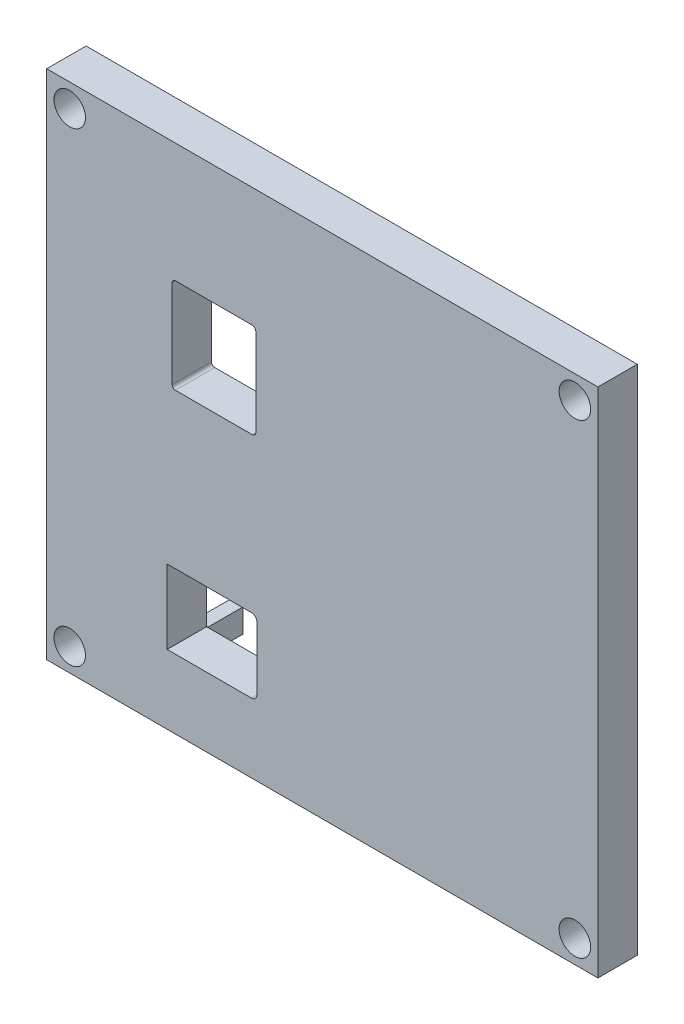
ISO-10303-21;
HEADER;
FILE_DESCRIPTION(('STEP AP214'),'2;1');
FILE_NAME('part.step','',(''),(''),'','','');
FILE_SCHEMA(('AUTOMOTIVE_DESIGN { 1 0 10303 214 1 1 1 1 }'));
ENDSEC;
DATA;
#1=APPLICATION_CONTEXT('core data for automotive mechanical design processes');
#2=APPLICATION_PROTOCOL_DEFINITION('international standard','automotive_design',2000,#1);
#3=PRODUCT_CONTEXT('',#1,'mechanical');
#4=PRODUCT('Part','Part','',(#3));
#5=PRODUCT_RELATED_PRODUCT_CATEGORY('part','',(#4));
#6=PRODUCT_DEFINITION_FORMATION('','',#4);
#7=PRODUCT_DEFINITION_CONTEXT('part definition',#1,'design');
#8=PRODUCT_DEFINITION('design','',#6,#7);
#9=PRODUCT_DEFINITION_SHAPE('','',#8);
#10=(LENGTH_UNIT() NAMED_UNIT(*) SI_UNIT(.MILLI.,.METRE.));
#11=(NAMED_UNIT(*) PLANE_ANGLE_UNIT() SI_UNIT($,.RADIAN.));
#12=(NAMED_UNIT(*) SI_UNIT($,.STERADIAN.) SOLID_ANGLE_UNIT());
#13=UNCERTAINTY_MEASURE_WITH_UNIT(LENGTH_MEASURE(1.E-05),#10,'distance_accuracy_value','');
#14=(GEOMETRIC_REPRESENTATION_CONTEXT(3) GLOBAL_UNCERTAINTY_ASSIGNED_CONTEXT((#13)) GLOBAL_UNIT_ASSIGNED_CONTEXT((#10,
#11,#12)) REPRESENTATION_CONTEXT('',''));
#15=CARTESIAN_POINT('',(0.,0.,0.));
#16=DIRECTION('',(0.,0.,1.));
#17=DIRECTION('',(1.,0.,0.));
#18=AXIS2_PLACEMENT_3D('',#15,#16,#17);
#19=CARTESIAN_POINT('',(0.,0.,0.));
#20=DIRECTION('',(0.,0.,1.));
#21=DIRECTION('',(1.,0.,0.));
#22=AXIS2_PLACEMENT_3D('',#19,#20,#21);
#23=PLANE('',#22);
#24=DIRECTION('',(0.,-1.,0.));
#25=VECTOR('',#24,1.);
#26=CARTESIAN_POINT('',(15.5,8.85,0.));
#27=LINE('',#26,#25);
#28=CARTESIAN_POINT('',(15.5,8.78500000000006,0.));
#29=VERTEX_POINT('',#28);
#30=CARTESIAN_POINT('',(15.5,5.85,0.));
#31=VERTEX_POINT('',#30);
#32=EDGE_CURVE('E11',#29,#31,#27,.T.);
#33=ORIENTED_EDGE('',*,*,#32,.F.);
#34=DIRECTION('',(1.,0.,0.));
#35=VECTOR('',#34,1.);
#36=CARTESIAN_POINT('',(0.,8.78500000000006,0.));
#37=LINE('',#36,#35);
#38=CARTESIAN_POINT('',(25.9999999999999,8.78500000000006,0.));
#39=VERTEX_POINT('',#38);
#40=EDGE_CURVE('E395',#29,#39,#37,.T.);
#41=ORIENTED_EDGE('',*,*,#40,.T.);
#42=CARTESIAN_POINT('',(25.9999999999999,9.48500000000006,0.));
#43=DIRECTION('',(0.,0.,1.));
#44=DIRECTION('',(1.,0.,0.));
#45=AXIS2_PLACEMENT_3D('',#42,#43,#44);
#46=CIRCLE('',#45,0.70000000000005);
#47=CARTESIAN_POINT('',(26.7,9.48500000000006,0.));
#48=VERTEX_POINT('',#47);
#49=EDGE_CURVE('E301',#39,#48,#46,.T.);
#50=ORIENTED_EDGE('',*,*,#49,.T.);
#51=DIRECTION('',(0.,1.,0.));
#52=VECTOR('',#51,1.);
#53=CARTESIAN_POINT('',(26.7,0.,0.));
#54=LINE('',#53,#52);
#55=CARTESIAN_POINT('',(26.7,17.485,0.));
#56=VERTEX_POINT('',#55);
#57=EDGE_CURVE('E413',#48,#56,#54,.T.);
#58=ORIENTED_EDGE('',*,*,#57,.T.);
#59=CARTESIAN_POINT('',(26.,17.485,0.));
#60=DIRECTION('',(0.,0.,1.));
#61=DIRECTION('',(1.,0.,0.));
#62=AXIS2_PLACEMENT_3D('',#59,#60,#61);
#63=CIRCLE('',#62,0.699999999999999);
#64=CARTESIAN_POINT('',(25.9999999999999,18.185,0.));
#65=VERTEX_POINT('',#64);
#66=EDGE_CURVE('E409',#56,#65,#63,.T.);
#67=ORIENTED_EDGE('',*,*,#66,.T.);
#68=DIRECTION('',(-1.,0.,0.));
#69=VECTOR('',#68,1.);
#70=CARTESIAN_POINT('',(0.,18.185,0.));
#71=LINE('',#70,#69);
#72=CARTESIAN_POINT('',(15.3,18.185,0.));
#73=VERTEX_POINT('',#72);
#74=EDGE_CURVE('E401',#65,#73,#71,.T.);
#75=ORIENTED_EDGE('',*,*,#74,.T.);
#76=DIRECTION('',(0.,-1.,0.));
#77=VECTOR('',#76,1.);
#78=CARTESIAN_POINT('',(15.3,0.,0.));
#79=LINE('',#78,#77);
#80=CARTESIAN_POINT('',(15.3,8.85,0.));
#81=VERTEX_POINT('',#80);
#82=EDGE_CURVE('E397',#73,#81,#79,.T.);
#83=ORIENTED_EDGE('',*,*,#82,.T.);
#84=DIRECTION('',(1.,0.,0.));
#85=VECTOR('',#84,1.);
#86=CARTESIAN_POINT('',(15.5,8.85,0.));
#87=LINE('',#86,#85);
#88=CARTESIAN_POINT('',(13.85,8.85,0.));
#89=VERTEX_POINT('',#88);
#90=EDGE_CURVE('E279',#89,#81,#87,.T.);
#91=ORIENTED_EDGE('',*,*,#90,.F.);
#92=DIRECTION('',(0.,-1.,0.));
#93=VECTOR('',#92,1.);
#94=CARTESIAN_POINT('',(13.85,8.85,0.));
#95=LINE('',#94,#93);
#96=CARTESIAN_POINT('',(13.85,5.85,0.));
#97=VERTEX_POINT('',#96);
#98=EDGE_CURVE('E292',#89,#97,#95,.T.);
#99=ORIENTED_EDGE('',*,*,#98,.T.);
#100=DIRECTION('',(1.,0.,0.));
#101=VECTOR('',#100,1.);
#102=CARTESIAN_POINT('',(15.5,5.85,0.));
#103=LINE('',#102,#101);
#104=EDGE_CURVE('E75',#97,#31,#103,.T.);
#105=ORIENTED_EDGE('',*,*,#104,.T.);
#106=EDGE_LOOP('',(#33,#41,#50,#58,#67,#75,#83,#91,#99,#105));
#107=FACE_BOUND('',#106,.T.);
#108=CARTESIAN_POINT('',(26.09,49.39,0.));
#109=DIRECTION('',(0.,0.,1.));
#110=DIRECTION('',(1.,0.,0.));
#111=AXIS2_PLACEMENT_3D('',#108,#109,#110);
#112=CIRCLE('',#111,0.46);
#113=CARTESIAN_POINT('',(26.55,49.39,0.));
#114=VERTEX_POINT('',#113);
#115=CARTESIAN_POINT('',(26.09,49.85,0.));
#116=VERTEX_POINT('',#115);
#117=EDGE_CURVE('E414',#114,#116,#112,.T.);
#118=ORIENTED_EDGE('',*,*,#117,.T.);
#119=DIRECTION('',(-1.,0.,0.));
#120=VECTOR('',#119,1.);
#121=CARTESIAN_POINT('',(0.,49.85,0.));
#122=LINE('',#121,#120);
#123=CARTESIAN_POINT('',(16.34,49.85,0.));
#124=VERTEX_POINT('',#123);
#125=EDGE_CURVE('E444',#116,#124,#122,.T.);
#126=ORIENTED_EDGE('',*,*,#125,.T.);
#127=CARTESIAN_POINT('',(16.34,49.44,0.));
#128=DIRECTION('',(0.,0.,1.));
#129=DIRECTION('',(1.,0.,0.));
#130=AXIS2_PLACEMENT_3D('',#127,#128,#129);
#131=CIRCLE('',#130,0.410000000000001);
#132=CARTESIAN_POINT('',(15.93,49.44,0.));
#133=VERTEX_POINT('',#132);
#134=EDGE_CURVE('E438',#124,#133,#131,.T.);
#135=ORIENTED_EDGE('',*,*,#134,.T.);
#136=DIRECTION('',(0.,-1.,0.));
#137=VECTOR('',#136,1.);
#138=CARTESIAN_POINT('',(15.93,0.,0.));
#139=LINE('',#138,#137);
#140=CARTESIAN_POINT('',(15.93,38.22,0.));
#141=VERTEX_POINT('',#140);
#142=EDGE_CURVE('E434',#133,#141,#139,.T.);
#143=ORIENTED_EDGE('',*,*,#142,.T.);
#144=CARTESIAN_POINT('',(16.34,38.22,0.));
#145=DIRECTION('',(0.,0.,1.));
#146=DIRECTION('',(1.,0.,0.));
#147=AXIS2_PLACEMENT_3D('',#144,#145,#146);
#148=CIRCLE('',#147,0.410000000000001);
#149=CARTESIAN_POINT('',(16.34,37.81,0.));
#150=VERTEX_POINT('',#149);
#151=EDGE_CURVE('E431',#141,#150,#148,.T.);
#152=ORIENTED_EDGE('',*,*,#151,.T.);
#153=DIRECTION('',(1.,0.,0.));
#154=VECTOR('',#153,1.);
#155=CARTESIAN_POINT('',(0.,37.81,0.));
#156=LINE('',#155,#154);
#157=CARTESIAN_POINT('',(26.09,37.81,0.));
#158=VERTEX_POINT('',#157);
#159=EDGE_CURVE('E430',#150,#158,#156,.T.);
#160=ORIENTED_EDGE('',*,*,#159,.T.);
#161=CARTESIAN_POINT('',(26.09,38.27,0.));
#162=DIRECTION('',(0.,0.,1.));
#163=DIRECTION('',(1.,0.,0.));
#164=AXIS2_PLACEMENT_3D('',#161,#162,#163);
#165=CIRCLE('',#164,0.46);
#166=CARTESIAN_POINT('',(26.55,38.27,0.));
#167=VERTEX_POINT('',#166);
#168=EDGE_CURVE('E421',#158,#167,#165,.T.);
#169=ORIENTED_EDGE('',*,*,#168,.T.);
#170=DIRECTION('',(0.,1.,0.));
#171=VECTOR('',#170,1.);
#172=CARTESIAN_POINT('',(26.55,0.,0.));
#173=LINE('',#172,#171);
#174=EDGE_CURVE('E420',#167,#114,#173,.T.);
#175=ORIENTED_EDGE('',*,*,#174,.T.);
#176=EDGE_LOOP('',(#118,#126,#135,#143,#152,#160,#169,#175));
#177=FACE_BOUND('',#176,.T.);
#178=CARTESIAN_POINT('',(67.075,2.925,0.));
#179=DIRECTION('',(0.,0.,1.));
#180=DIRECTION('',(1.,0.,0.));
#181=AXIS2_PLACEMENT_3D('',#178,#179,#180);
#182=CIRCLE('',#181,2.);
#183=CARTESIAN_POINT('',(69.075,2.925,0.));
#184=VERTEX_POINT('',#183);
#185=EDGE_CURVE('E449',#184,#184,#182,.T.);
#186=ORIENTED_EDGE('',*,*,#185,.T.);
#187=EDGE_LOOP('',(#186));
#188=FACE_BOUND('',#187,.T.);
#189=CARTESIAN_POINT('',(2.925,62.075,0.));
#190=DIRECTION('',(0.,0.,1.));
#191=DIRECTION('',(1.,0.,0.));
#192=AXIS2_PLACEMENT_3D('',#189,#190,#191);
#193=CIRCLE('',#192,2.);
#194=CARTESIAN_POINT('',(4.925,62.075,0.));
#195=VERTEX_POINT('',#194);
#196=EDGE_CURVE('E453',#195,#195,#193,.T.);
#197=ORIENTED_EDGE('',*,*,#196,.T.);
#198=EDGE_LOOP('',(#197));
#199=FACE_BOUND('',#198,.T.);
#200=CARTESIAN_POINT('',(2.925,2.925,0.));
#201=DIRECTION('',(0.,0.,1.));
#202=DIRECTION('',(1.,0.,0.));
#203=AXIS2_PLACEMENT_3D('',#200,#201,#202);
#204=CIRCLE('',#203,2.);
#205=CARTESIAN_POINT('',(4.925,2.925,0.));
#206=VERTEX_POINT('',#205);
#207=EDGE_CURVE('E454',#206,#206,#204,.T.);
#208=ORIENTED_EDGE('',*,*,#207,.T.);
#209=EDGE_LOOP('',(#208));
#210=FACE_BOUND('',#209,.T.);
#211=CARTESIAN_POINT('',(67.075,62.075,0.));
#212=DIRECTION('',(0.,0.,1.));
#213=DIRECTION('',(1.,0.,0.));
#214=AXIS2_PLACEMENT_3D('',#211,#212,#213);
#215=CIRCLE('',#214,2.);
#216=CARTESIAN_POINT('',(69.075,62.075,0.));
#217=VERTEX_POINT('',#216);
#218=EDGE_CURVE('E459',#217,#217,#215,.T.);
#219=ORIENTED_EDGE('',*,*,#218,.T.);
#220=EDGE_LOOP('',(#219));
#221=FACE_BOUND('',#220,.T.);
#222=DIRECTION('',(0.,-1.,0.));
#223=VECTOR('',#222,1.);
#224=CARTESIAN_POINT('',(0.,0.,0.));
#225=LINE('',#224,#223);
#226=CARTESIAN_POINT('',(0.,65.,0.));
#227=VERTEX_POINT('',#226);
#228=CARTESIAN_POINT('',(0.,0.,0.));
#229=VERTEX_POINT('',#228);
#230=EDGE_CURVE('E462',#227,#229,#225,.T.);
#231=ORIENTED_EDGE('',*,*,#230,.F.);
#232=DIRECTION('',(-1.,0.,0.));
#233=VECTOR('',#232,1.);
#234=CARTESIAN_POINT('',(0.,65.,0.));
#235=LINE('',#234,#233);
#236=CARTESIAN_POINT('',(70.,65.,0.));
#237=VERTEX_POINT('',#236);
#238=EDGE_CURVE('E310',#237,#227,#235,.T.);
#239=ORIENTED_EDGE('',*,*,#238,.F.);
#240=DIRECTION('',(0.,1.,0.));
#241=VECTOR('',#240,1.);
#242=CARTESIAN_POINT('',(70.,0.,0.));
#243=LINE('',#242,#241);
#244=CARTESIAN_POINT('',(70.,0.,0.));
#245=VERTEX_POINT('',#244);
#246=EDGE_CURVE('E469',#245,#237,#243,.T.);
#247=ORIENTED_EDGE('',*,*,#246,.F.);
#248=DIRECTION('',(1.,0.,0.));
#249=VECTOR('',#248,1.);
#250=CARTESIAN_POINT('',(0.,0.,0.));
#251=LINE('',#250,#249);
#252=EDGE_CURVE('E470',#229,#245,#251,.T.);
#253=ORIENTED_EDGE('',*,*,#252,.F.);
#254=EDGE_LOOP('',(#231,#239,#247,#253));
#255=FACE_BOUND('',#254,.T.);
#256=DIRECTION('',(-1.,0.,0.));
#257=VECTOR('',#256,1.);
#258=CARTESIAN_POINT('',(13.85,56.15,0.));
#259=LINE('',#258,#257);
#260=CARTESIAN_POINT('',(15.93,56.15,0.));
#261=VERTEX_POINT('',#260);
#262=CARTESIAN_POINT('',(13.85,56.15,0.));
#263=VERTEX_POINT('',#262);
#264=EDGE_CURVE('E248',#261,#263,#259,.T.);
#265=ORIENTED_EDGE('',*,*,#264,.F.);
#266=DIRECTION('',(0.,1.,0.));
#267=VECTOR('',#266,1.);
#268=CARTESIAN_POINT('',(15.93,56.15,0.));
#269=LINE('',#268,#267);
#270=CARTESIAN_POINT('',(15.93,59.15,0.));
#271=VERTEX_POINT('',#270);
#272=EDGE_CURVE('E263',#261,#271,#269,.T.);
#273=ORIENTED_EDGE('',*,*,#272,.T.);
#274=DIRECTION('',(-1.,0.,0.));
#275=VECTOR('',#274,1.);
#276=CARTESIAN_POINT('',(13.85,59.15,0.));
#277=LINE('',#276,#275);
#278=CARTESIAN_POINT('',(13.85,59.15,0.));
#279=VERTEX_POINT('',#278);
#280=EDGE_CURVE('E249',#271,#279,#277,.T.);
#281=ORIENTED_EDGE('',*,*,#280,.T.);
#282=DIRECTION('',(0.,1.,0.));
#283=VECTOR('',#282,1.);
#284=CARTESIAN_POINT('',(13.85,56.15,0.));
#285=LINE('',#284,#283);
#286=EDGE_CURVE('E565',#263,#279,#285,.T.);
#287=ORIENTED_EDGE('',*,*,#286,.F.);
#288=EDGE_LOOP('',(#265,#273,#281,#287));
#289=FACE_BOUND('',#288,.T.);
#290=ADVANCED_FACE('F44',(#107,#177,#188,#199,#210,#221,#255,#289),#23,.F.);
#291=CARTESIAN_POINT('',(0.,0.,5.));
#292=DIRECTION('',(1.,0.,0.));
#293=DIRECTION('',(0.,0.,-1.));
#294=AXIS2_PLACEMENT_3D('',#291,#292,#293);
#295=PLANE('',#294);
#296=ORIENTED_EDGE('',*,*,#230,.T.);
#297=DIRECTION('',(0.,0.,-1.));
#298=VECTOR('',#297,1.);
#299=CARTESIAN_POINT('',(0.,0.,5.));
#300=LINE('',#299,#298);
#301=CARTESIAN_POINT('',(0.,0.,5.));
#302=VERTEX_POINT('',#301);
#303=EDGE_CURVE('E54',#302,#229,#300,.T.);
#304=ORIENTED_EDGE('',*,*,#303,.F.);
#305=DIRECTION('',(0.,-1.,0.));
#306=VECTOR('',#305,1.);
#307=CARTESIAN_POINT('',(0.,0.,5.));
#308=LINE('',#307,#306);
#309=CARTESIAN_POINT('',(0.,65.,5.));
#310=VERTEX_POINT('',#309);
#311=EDGE_CURVE('E380',#310,#302,#308,.T.);
#312=ORIENTED_EDGE('',*,*,#311,.F.);
#313=DIRECTION('',(0.,0.,-1.));
#314=VECTOR('',#313,1.);
#315=CARTESIAN_POINT('',(0.,65.,5.));
#316=LINE('',#315,#314);
#317=EDGE_CURVE('E474',#310,#227,#316,.T.);
#318=ORIENTED_EDGE('',*,*,#317,.T.);
#319=EDGE_LOOP('',(#296,#304,#312,#318));
#320=FACE_BOUND('',#319,.T.);
#321=ADVANCED_FACE('F593',(#320),#295,.F.);
#322=CARTESIAN_POINT('',(0.,0.,5.));
#323=DIRECTION('',(0.,1.,0.));
#324=DIRECTION('',(0.,0.,1.));
#325=AXIS2_PLACEMENT_3D('',#322,#323,#324);
#326=PLANE('',#325);
#327=ORIENTED_EDGE('',*,*,#252,.T.);
#328=DIRECTION('',(0.,0.,-1.));
#329=VECTOR('',#328,1.);
#330=CARTESIAN_POINT('',(70.,0.,5.));
#331=LINE('',#330,#329);
#332=CARTESIAN_POINT('',(70.,0.,5.));
#333=VERTEX_POINT('',#332);
#334=EDGE_CURVE('E482',#333,#245,#331,.T.);
#335=ORIENTED_EDGE('',*,*,#334,.F.);
#336=DIRECTION('',(1.,0.,0.));
#337=VECTOR('',#336,1.);
#338=CARTESIAN_POINT('',(0.,0.,5.));
#339=LINE('',#338,#337);
#340=EDGE_CURVE('E381',#302,#333,#339,.T.);
#341=ORIENTED_EDGE('',*,*,#340,.F.);
#342=ORIENTED_EDGE('',*,*,#303,.T.);
#343=EDGE_LOOP('',(#327,#335,#341,#342));
#344=FACE_BOUND('',#343,.T.);
#345=ADVANCED_FACE('F600',(#344),#326,.F.);
#346=CARTESIAN_POINT('',(70.,0.,5.));
#347=DIRECTION('',(-1.,0.,0.));
#348=DIRECTION('',(0.,0.,1.));
#349=AXIS2_PLACEMENT_3D('',#346,#347,#348);
#350=PLANE('',#349);
#351=ORIENTED_EDGE('',*,*,#246,.T.);
#352=DIRECTION('',(0.,0.,-1.));
#353=VECTOR('',#352,1.);
#354=CARTESIAN_POINT('',(70.,65.,5.));
#355=LINE('',#354,#353);
#356=CARTESIAN_POINT('',(70.,65.,5.));
#357=VERTEX_POINT('',#356);
#358=EDGE_CURVE('E479',#357,#237,#355,.T.);
#359=ORIENTED_EDGE('',*,*,#358,.F.);
#360=DIRECTION('',(0.,1.,0.));
#361=VECTOR('',#360,1.);
#362=CARTESIAN_POINT('',(70.,0.,5.));
#363=LINE('',#362,#361);
#364=EDGE_CURVE('E383',#333,#357,#363,.T.);
#365=ORIENTED_EDGE('',*,*,#364,.F.);
#366=ORIENTED_EDGE('',*,*,#334,.T.);
#367=EDGE_LOOP('',(#351,#359,#365,#366));
#368=FACE_BOUND('',#367,.T.);
#369=ADVANCED_FACE('F609',(#368),#350,.F.);
#370=CARTESIAN_POINT('',(26.09,49.39,5.));
#371=DIRECTION('',(0.,0.,-1.));
#372=DIRECTION('',(-1.,0.,0.));
#373=AXIS2_PLACEMENT_3D('',#370,#371,#372);
#374=CYLINDRICAL_SURFACE('',#373,0.46);
#375=ORIENTED_EDGE('',*,*,#117,.F.);
#376=DIRECTION('',(0.,0.,-1.));
#377=VECTOR('',#376,1.);
#378=CARTESIAN_POINT('',(26.55,49.39,5.));
#379=LINE('',#378,#377);
#380=CARTESIAN_POINT('',(26.55,49.39,5.));
#381=VERTEX_POINT('',#380);
#382=EDGE_CURVE('E477',#381,#114,#379,.T.);
#383=ORIENTED_EDGE('',*,*,#382,.F.);
#384=CARTESIAN_POINT('',(26.09,49.39,5.));
#385=DIRECTION('',(0.,0.,1.));
#386=DIRECTION('',(1.,0.,0.));
#387=AXIS2_PLACEMENT_3D('',#384,#385,#386);
#388=CIRCLE('',#387,0.46);
#389=CARTESIAN_POINT('',(26.09,49.85,5.));
#390=VERTEX_POINT('',#389);
#391=EDGE_CURVE('E328',#381,#390,#388,.T.);
#392=ORIENTED_EDGE('',*,*,#391,.T.);
#393=DIRECTION('',(0.,0.,-1.));
#394=VECTOR('',#393,1.);
#395=CARTESIAN_POINT('',(26.09,49.85,5.));
#396=LINE('',#395,#394);
#397=EDGE_CURVE('E491',#390,#116,#396,.T.);
#398=ORIENTED_EDGE('',*,*,#397,.T.);
#399=EDGE_LOOP('',(#375,#383,#392,#398));
#400=FACE_BOUND('',#399,.T.);
#401=ADVANCED_FACE('F613',(#400),#374,.F.);
#402=CARTESIAN_POINT('',(26.55,0.,5.));
#403=DIRECTION('',(-1.,0.,0.));
#404=DIRECTION('',(0.,0.,1.));
#405=AXIS2_PLACEMENT_3D('',#402,#403,#404);
#406=PLANE('',#405);
#407=ORIENTED_EDGE('',*,*,#174,.F.);
#408=DIRECTION('',(0.,0.,-1.));
#409=VECTOR('',#408,1.);
#410=CARTESIAN_POINT('',(26.55,38.27,5.));
#411=LINE('',#410,#409);
#412=CARTESIAN_POINT('',(26.55,38.27,5.));
#413=VERTEX_POINT('',#412);
#414=EDGE_CURVE('E507',#413,#167,#411,.T.);
#415=ORIENTED_EDGE('',*,*,#414,.F.);
#416=DIRECTION('',(0.,1.,0.));
#417=VECTOR('',#416,1.);
#418=CARTESIAN_POINT('',(26.55,0.,5.));
#419=LINE('',#418,#417);
#420=EDGE_CURVE('E334',#413,#381,#419,.T.);
#421=ORIENTED_EDGE('',*,*,#420,.T.);
#422=ORIENTED_EDGE('',*,*,#382,.T.);
#423=EDGE_LOOP('',(#407,#415,#421,#422));
#424=FACE_BOUND('',#423,.T.);
#425=ADVANCED_FACE('F654',(#424),#406,.T.);
#426=CARTESIAN_POINT('',(26.09,38.27,5.));
#427=DIRECTION('',(0.,0.,-1.));
#428=DIRECTION('',(-1.,0.,0.));
#429=AXIS2_PLACEMENT_3D('',#426,#427,#428);
#430=CYLINDRICAL_SURFACE('',#429,0.46);
#431=ORIENTED_EDGE('',*,*,#168,.F.);
#432=DIRECTION('',(0.,0.,-1.));
#433=VECTOR('',#432,1.);
#434=CARTESIAN_POINT('',(26.09,37.81,5.));
#435=LINE('',#434,#433);
#436=CARTESIAN_POINT('',(26.09,37.81,5.));
#437=VERTEX_POINT('',#436);
#438=EDGE_CURVE('E508',#437,#158,#435,.T.);
#439=ORIENTED_EDGE('',*,*,#438,.F.);
#440=CARTESIAN_POINT('',(26.09,38.27,5.));
#441=DIRECTION('',(0.,0.,1.));
#442=DIRECTION('',(1.,0.,0.));
#443=AXIS2_PLACEMENT_3D('',#440,#441,#442);
#444=CIRCLE('',#443,0.46);
#445=EDGE_CURVE('E339',#437,#413,#444,.T.);
#446=ORIENTED_EDGE('',*,*,#445,.T.);
#447=ORIENTED_EDGE('',*,*,#414,.T.);
#448=EDGE_LOOP('',(#431,#439,#446,#447));
#449=FACE_BOUND('',#448,.T.);
#450=ADVANCED_FACE('F651',(#449),#430,.F.);
#451=CARTESIAN_POINT('',(0.,37.81,5.));
#452=DIRECTION('',(0.,1.,0.));
#453=DIRECTION('',(0.,0.,1.));
#454=AXIS2_PLACEMENT_3D('',#451,#452,#453);
#455=PLANE('',#454);
#456=ORIENTED_EDGE('',*,*,#159,.F.);
#457=DIRECTION('',(0.,0.,-1.));
#458=VECTOR('',#457,1.);
#459=CARTESIAN_POINT('',(16.34,37.81,5.));
#460=LINE('',#459,#458);
#461=CARTESIAN_POINT('',(16.34,37.81,5.));
#462=VERTEX_POINT('',#461);
#463=EDGE_CURVE('E502',#462,#150,#460,.T.);
#464=ORIENTED_EDGE('',*,*,#463,.F.);
#465=DIRECTION('',(1.,0.,0.));
#466=VECTOR('',#465,1.);
#467=CARTESIAN_POINT('',(0.,37.81,5.));
#468=LINE('',#467,#466);
#469=EDGE_CURVE('E343',#462,#437,#468,.T.);
#470=ORIENTED_EDGE('',*,*,#469,.T.);
#471=ORIENTED_EDGE('',*,*,#438,.T.);
#472=EDGE_LOOP('',(#456,#464,#470,#471));
#473=FACE_BOUND('',#472,.T.);
#474=ADVANCED_FACE('F650',(#473),#455,.T.);
#475=CARTESIAN_POINT('',(16.34,38.22,5.));
#476=DIRECTION('',(0.,0.,-1.));
#477=DIRECTION('',(-1.,0.,0.));
#478=AXIS2_PLACEMENT_3D('',#475,#476,#477);
#479=CYLINDRICAL_SURFACE('',#478,0.410000000000001);
#480=ORIENTED_EDGE('',*,*,#151,.F.);
#481=DIRECTION('',(0.,0.,-1.));
#482=VECTOR('',#481,1.);
#483=CARTESIAN_POINT('',(15.93,38.22,5.));
#484=LINE('',#483,#482);
#485=CARTESIAN_POINT('',(15.93,38.22,5.));
#486=VERTEX_POINT('',#485);
#487=EDGE_CURVE('E498',#486,#141,#484,.T.);
#488=ORIENTED_EDGE('',*,*,#487,.F.);
#489=CARTESIAN_POINT('',(16.34,38.22,5.));
#490=DIRECTION('',(0.,0.,1.));
#491=DIRECTION('',(1.,0.,0.));
#492=AXIS2_PLACEMENT_3D('',#489,#490,#491);
#493=CIRCLE('',#492,0.410000000000001);
#494=EDGE_CURVE('E344',#486,#462,#493,.T.);
#495=ORIENTED_EDGE('',*,*,#494,.T.);
#496=ORIENTED_EDGE('',*,*,#463,.T.);
#497=EDGE_LOOP('',(#480,#488,#495,#496));
#498=FACE_BOUND('',#497,.T.);
#499=ADVANCED_FACE('F641',(#498),#479,.F.);
#500=CARTESIAN_POINT('',(15.93,0.,5.));
#501=DIRECTION('',(1.,0.,0.));
#502=DIRECTION('',(0.,0.,-1.));
#503=AXIS2_PLACEMENT_3D('',#500,#501,#502);
#504=PLANE('',#503);
#505=ORIENTED_EDGE('',*,*,#142,.F.);
#506=DIRECTION('',(0.,0.,-1.));
#507=VECTOR('',#506,1.);
#508=CARTESIAN_POINT('',(15.93,49.44,5.));
#509=LINE('',#508,#507);
#510=CARTESIAN_POINT('',(15.93,49.44,5.));
#511=VERTEX_POINT('',#510);
#512=EDGE_CURVE('E500',#511,#133,#509,.T.);
#513=ORIENTED_EDGE('',*,*,#512,.F.);
#514=DIRECTION('',(0.,-1.,0.));
#515=VECTOR('',#514,1.);
#516=CARTESIAN_POINT('',(15.93,0.,5.));
#517=LINE('',#516,#515);
#518=EDGE_CURVE('E349',#511,#486,#517,.T.);
#519=ORIENTED_EDGE('',*,*,#518,.T.);
#520=ORIENTED_EDGE('',*,*,#487,.T.);
#521=EDGE_LOOP('',(#505,#513,#519,#520));
#522=FACE_BOUND('',#521,.T.);
#523=ADVANCED_FACE('F640',(#522),#504,.T.);
#524=CARTESIAN_POINT('',(16.34,49.44,5.));
#525=DIRECTION('',(0.,0.,-1.));
#526=DIRECTION('',(-1.,0.,0.));
#527=AXIS2_PLACEMENT_3D('',#524,#525,#526);
#528=CYLINDRICAL_SURFACE('',#527,0.410000000000001);
#529=ORIENTED_EDGE('',*,*,#134,.F.);
#530=DIRECTION('',(0.,0.,-1.));
#531=VECTOR('',#530,1.);
#532=CARTESIAN_POINT('',(16.34,49.85,5.));
#533=LINE('',#532,#531);
#534=CARTESIAN_POINT('',(16.34,49.85,5.));
#535=VERTEX_POINT('',#534);
#536=EDGE_CURVE('E493',#535,#124,#533,.T.);
#537=ORIENTED_EDGE('',*,*,#536,.F.);
#538=CARTESIAN_POINT('',(16.34,49.44,5.));
#539=DIRECTION('',(0.,0.,1.));
#540=DIRECTION('',(1.,0.,0.));
#541=AXIS2_PLACEMENT_3D('',#538,#539,#540);
#542=CIRCLE('',#541,0.410000000000001);
#543=EDGE_CURVE('E352',#535,#511,#542,.T.);
#544=ORIENTED_EDGE('',*,*,#543,.T.);
#545=ORIENTED_EDGE('',*,*,#512,.T.);
#546=EDGE_LOOP('',(#529,#537,#544,#545));
#547=FACE_BOUND('',#546,.T.);
#548=ADVANCED_FACE('F638',(#547),#528,.F.);
#549=CARTESIAN_POINT('',(25.9999999999999,9.48500000000006,5.));
#550=DIRECTION('',(0.,0.,-1.));
#551=DIRECTION('',(-1.,0.,0.));
#552=AXIS2_PLACEMENT_3D('',#549,#550,#551);
#553=CYLINDRICAL_SURFACE('',#552,0.70000000000005);
#554=ORIENTED_EDGE('',*,*,#49,.F.);
#555=DIRECTION('',(0.,0.,-1.));
#556=VECTOR('',#555,1.);
#557=CARTESIAN_POINT('',(25.9999999999999,8.78500000000006,5.));
#558=LINE('',#557,#556);
#559=CARTESIAN_POINT('',(25.9999999999999,8.78500000000006,5.));
#560=VERTEX_POINT('',#559);
#561=EDGE_CURVE('E47',#560,#39,#558,.T.);
#562=ORIENTED_EDGE('',*,*,#561,.F.);
#563=CARTESIAN_POINT('',(25.9999999999999,9.48500000000006,5.));
#564=DIRECTION('',(0.,0.,1.));
#565=DIRECTION('',(1.,0.,0.));
#566=AXIS2_PLACEMENT_3D('',#563,#564,#565);
#567=CIRCLE('',#566,0.70000000000005);
#568=CARTESIAN_POINT('',(26.7,9.48500000000006,5.));
#569=VERTEX_POINT('',#568);
#570=EDGE_CURVE('E302',#560,#569,#567,.T.);
#571=ORIENTED_EDGE('',*,*,#570,.T.);
#572=DIRECTION('',(0.,0.,-1.));
#573=VECTOR('',#572,1.);
#574=CARTESIAN_POINT('',(26.7,9.48500000000006,5.));
#575=LINE('',#574,#573);
#576=EDGE_CURVE('E388',#569,#48,#575,.T.);
#577=ORIENTED_EDGE('',*,*,#576,.T.);
#578=EDGE_LOOP('',(#554,#562,#571,#577));
#579=FACE_BOUND('',#578,.T.);
#580=ADVANCED_FACE('F50',(#579),#553,.F.);
#581=CARTESIAN_POINT('',(0.,8.78500000000006,5.));
#582=DIRECTION('',(0.,1.,0.));
#583=DIRECTION('',(0.,0.,1.));
#584=AXIS2_PLACEMENT_3D('',#581,#582,#583);
#585=PLANE('',#584);
#586=CARTESIAN_POINT('',(15.3,8.78500000000006,0.));
#587=VERTEX_POINT('',#586);
#588=EDGE_CURVE('E391',#587,#29,#37,.T.);
#589=ORIENTED_EDGE('',*,*,#588,.F.);
#590=DIRECTION('',(0.,0.,-1.));
#591=VECTOR('',#590,1.);
#592=CARTESIAN_POINT('',(15.3,8.78500000000006,5.));
#593=LINE('',#592,#591);
#594=CARTESIAN_POINT('',(15.3,8.78500000000006,5.));
#595=VERTEX_POINT('',#594);
#596=EDGE_CURVE('E522',#595,#587,#593,.T.);
#597=ORIENTED_EDGE('',*,*,#596,.F.);
#598=DIRECTION('',(1.,0.,0.));
#599=VECTOR('',#598,1.);
#600=CARTESIAN_POINT('',(0.,8.78500000000006,5.));
#601=LINE('',#600,#599);
#602=EDGE_CURVE('E306',#595,#560,#601,.T.);
#603=ORIENTED_EDGE('',*,*,#602,.T.);
#604=ORIENTED_EDGE('',*,*,#561,.T.);
#605=ORIENTED_EDGE('',*,*,#40,.F.);
#606=EDGE_LOOP('',(#589,#597,#603,#604,#605));
#607=FACE_BOUND('',#606,.T.);
#608=ADVANCED_FACE('F532',(#607),#585,.T.);
#609=CARTESIAN_POINT('',(15.3,0.,5.));
#610=DIRECTION('',(1.,0.,0.));
#611=DIRECTION('',(0.,0.,-1.));
#612=AXIS2_PLACEMENT_3D('',#609,#610,#611);
#613=PLANE('',#612);
#614=ORIENTED_EDGE('',*,*,#82,.F.);
#615=DIRECTION('',(0.,0.,-1.));
#616=VECTOR('',#615,1.);
#617=CARTESIAN_POINT('',(15.3,18.185,5.));
#618=LINE('',#617,#616);
#619=CARTESIAN_POINT('',(15.3,18.185,5.));
#620=VERTEX_POINT('',#619);
#621=EDGE_CURVE('E525',#620,#73,#618,.T.);
#622=ORIENTED_EDGE('',*,*,#621,.F.);
#623=DIRECTION('',(0.,-1.,0.));
#624=VECTOR('',#623,1.);
#625=CARTESIAN_POINT('',(15.3,0.,5.));
#626=LINE('',#625,#624);
#627=EDGE_CURVE('E311',#620,#595,#626,.T.);
#628=ORIENTED_EDGE('',*,*,#627,.T.);
#629=ORIENTED_EDGE('',*,*,#596,.T.);
#630=EDGE_CURVE('E396',#81,#587,#79,.T.);
#631=ORIENTED_EDGE('',*,*,#630,.F.);
#632=EDGE_LOOP('',(#614,#622,#628,#629,#631));
#633=FACE_BOUND('',#632,.T.);
#634=ADVANCED_FACE('F559',(#633),#613,.T.);
#635=CARTESIAN_POINT('',(0.,18.185,5.));
#636=DIRECTION('',(0.,-1.,0.));
#637=DIRECTION('',(0.,0.,-1.));
#638=AXIS2_PLACEMENT_3D('',#635,#636,#637);
#639=PLANE('',#638);
#640=ORIENTED_EDGE('',*,*,#74,.F.);
#641=DIRECTION('',(0.,0.,-1.));
#642=VECTOR('',#641,1.);
#643=CARTESIAN_POINT('',(25.9999999999999,18.185,5.));
#644=LINE('',#643,#642);
#645=CARTESIAN_POINT('',(25.9999999999999,18.185,5.));
#646=VERTEX_POINT('',#645);
#647=EDGE_CURVE('E520',#646,#65,#644,.T.);
#648=ORIENTED_EDGE('',*,*,#647,.F.);
#649=DIRECTION('',(-1.,0.,0.));
#650=VECTOR('',#649,1.);
#651=CARTESIAN_POINT('',(0.,18.185,5.));
#652=LINE('',#651,#650);
#653=EDGE_CURVE('E320',#646,#620,#652,.T.);
#654=ORIENTED_EDGE('',*,*,#653,.T.);
#655=ORIENTED_EDGE('',*,*,#621,.T.);
#656=EDGE_LOOP('',(#640,#648,#654,#655));
#657=FACE_BOUND('',#656,.T.);
#658=ADVANCED_FACE('F551',(#657),#639,.T.);
#659=CARTESIAN_POINT('',(26.,17.485,5.));
#660=DIRECTION('',(0.,0.,-1.));
#661=DIRECTION('',(-1.,0.,0.));
#662=AXIS2_PLACEMENT_3D('',#659,#660,#661);
#663=CYLINDRICAL_SURFACE('',#662,0.699999999999999);
#664=ORIENTED_EDGE('',*,*,#66,.F.);
#665=DIRECTION('',(0.,0.,-1.));
#666=VECTOR('',#665,1.);
#667=CARTESIAN_POINT('',(26.7,17.485,5.));
#668=LINE('',#667,#666);
#669=CARTESIAN_POINT('',(26.7,17.485,5.));
#670=VERTEX_POINT('',#669);
#671=EDGE_CURVE('E518',#670,#56,#668,.T.);
#672=ORIENTED_EDGE('',*,*,#671,.F.);
#673=CARTESIAN_POINT('',(26.,17.485,5.));
#674=DIRECTION('',(0.,0.,1.));
#675=DIRECTION('',(1.,0.,0.));
#676=AXIS2_PLACEMENT_3D('',#673,#674,#675);
#677=CIRCLE('',#676,0.699999999999999);
#678=EDGE_CURVE('E321',#670,#646,#677,.T.);
#679=ORIENTED_EDGE('',*,*,#678,.T.);
#680=ORIENTED_EDGE('',*,*,#647,.T.);
#681=EDGE_LOOP('',(#664,#672,#679,#680));
#682=FACE_BOUND('',#681,.T.);
#683=ADVANCED_FACE('F548',(#682),#663,.F.);
#684=CARTESIAN_POINT('',(67.075,62.075,5.));
#685=DIRECTION('',(0.,0.,-1.));
#686=DIRECTION('',(-1.,0.,0.));
#687=AXIS2_PLACEMENT_3D('',#684,#685,#686);
#688=CYLINDRICAL_SURFACE('',#687,2.);
#689=CARTESIAN_POINT('',(67.075,62.075,5.));
#690=DIRECTION('',(0.,0.,1.));
#691=DIRECTION('',(1.,0.,0.));
#692=AXIS2_PLACEMENT_3D('',#689,#690,#691);
#693=CIRCLE('',#692,2.);
#694=CARTESIAN_POINT('',(69.075,62.075,5.));
#695=VERTEX_POINT('',#694);
#696=EDGE_CURVE('E373',#695,#695,#693,.T.);
#697=ORIENTED_EDGE('',*,*,#696,.T.);
#698=EDGE_LOOP('',(#697));
#699=FACE_BOUND('',#698,.T.);
#700=ORIENTED_EDGE('',*,*,#218,.F.);
#701=EDGE_LOOP('',(#700));
#702=FACE_BOUND('',#701,.T.);
#703=ADVANCED_FACE('F618',(#699,#702),#688,.F.);
#704=CARTESIAN_POINT('',(2.925,2.925,5.));
#705=DIRECTION('',(0.,0.,-1.));
#706=DIRECTION('',(-1.,0.,0.));
#707=AXIS2_PLACEMENT_3D('',#704,#705,#706);
#708=CYLINDRICAL_SURFACE('',#707,2.);
#709=CARTESIAN_POINT('',(2.925,2.925,5.));
#710=DIRECTION('',(0.,0.,1.));
#711=DIRECTION('',(1.,0.,0.));
#712=AXIS2_PLACEMENT_3D('',#709,#710,#711);
#713=CIRCLE('',#712,2.);
#714=CARTESIAN_POINT('',(4.925,2.925,5.));
#715=VERTEX_POINT('',#714);
#716=EDGE_CURVE('E369',#715,#715,#713,.T.);
#717=ORIENTED_EDGE('',*,*,#716,.T.);
#718=EDGE_LOOP('',(#717));
#719=FACE_BOUND('',#718,.T.);
#720=ORIENTED_EDGE('',*,*,#207,.F.);
#721=EDGE_LOOP('',(#720));
#722=FACE_BOUND('',#721,.T.);
#723=ADVANCED_FACE('F617',(#719,#722),#708,.F.);
#724=CARTESIAN_POINT('',(2.925,62.075,5.));
#725=DIRECTION('',(0.,0.,-1.));
#726=DIRECTION('',(-1.,0.,0.));
#727=AXIS2_PLACEMENT_3D('',#724,#725,#726);
#728=CYLINDRICAL_SURFACE('',#727,2.);
#729=CARTESIAN_POINT('',(2.925,62.075,5.));
#730=DIRECTION('',(0.,0.,1.));
#731=DIRECTION('',(1.,0.,0.));
#732=AXIS2_PLACEMENT_3D('',#729,#730,#731);
#733=CIRCLE('',#732,2.);
#734=CARTESIAN_POINT('',(4.925,62.075,5.));
#735=VERTEX_POINT('',#734);
#736=EDGE_CURVE('E364',#735,#735,#733,.T.);
#737=ORIENTED_EDGE('',*,*,#736,.T.);
#738=EDGE_LOOP('',(#737));
#739=FACE_BOUND('',#738,.T.);
#740=ORIENTED_EDGE('',*,*,#196,.F.);
#741=EDGE_LOOP('',(#740));
#742=FACE_BOUND('',#741,.T.);
#743=ADVANCED_FACE('F621',(#739,#742),#728,.F.);
#744=CARTESIAN_POINT('',(67.075,2.925,5.));
#745=DIRECTION('',(0.,0.,-1.));
#746=DIRECTION('',(-1.,0.,0.));
#747=AXIS2_PLACEMENT_3D('',#744,#745,#746);
#748=CYLINDRICAL_SURFACE('',#747,2.);
#749=CARTESIAN_POINT('',(67.075,2.925,5.));
#750=DIRECTION('',(0.,0.,1.));
#751=DIRECTION('',(1.,0.,0.));
#752=AXIS2_PLACEMENT_3D('',#749,#750,#751);
#753=CIRCLE('',#752,2.);
#754=CARTESIAN_POINT('',(69.075,2.925,5.));
#755=VERTEX_POINT('',#754);
#756=EDGE_CURVE('E363',#755,#755,#753,.T.);
#757=ORIENTED_EDGE('',*,*,#756,.T.);
#758=EDGE_LOOP('',(#757));
#759=FACE_BOUND('',#758,.T.);
#760=ORIENTED_EDGE('',*,*,#185,.F.);
#761=EDGE_LOOP('',(#760));
#762=FACE_BOUND('',#761,.T.);
#763=ADVANCED_FACE('F629',(#759,#762),#748,.F.);
#764=CARTESIAN_POINT('',(0.,49.85,5.));
#765=DIRECTION('',(0.,-1.,0.));
#766=DIRECTION('',(0.,0.,-1.));
#767=AXIS2_PLACEMENT_3D('',#764,#765,#766);
#768=PLANE('',#767);
#769=ORIENTED_EDGE('',*,*,#125,.F.);
#770=ORIENTED_EDGE('',*,*,#397,.F.);
#771=DIRECTION('',(-1.,0.,0.));
#772=VECTOR('',#771,1.);
#773=CARTESIAN_POINT('',(0.,49.85,5.));
#774=LINE('',#773,#772);
#775=EDGE_CURVE('E360',#390,#535,#774,.T.);
#776=ORIENTED_EDGE('',*,*,#775,.T.);
#777=ORIENTED_EDGE('',*,*,#536,.T.);
#778=EDGE_LOOP('',(#769,#770,#776,#777));
#779=FACE_BOUND('',#778,.T.);
#780=ADVANCED_FACE('F633',(#779),#768,.T.);
#781=CARTESIAN_POINT('',(26.7,0.,5.));
#782=DIRECTION('',(-1.,0.,0.));
#783=DIRECTION('',(0.,0.,1.));
#784=AXIS2_PLACEMENT_3D('',#781,#782,#783);
#785=PLANE('',#784);
#786=ORIENTED_EDGE('',*,*,#57,.F.);
#787=ORIENTED_EDGE('',*,*,#576,.F.);
#788=DIRECTION('',(0.,1.,0.));
#789=VECTOR('',#788,1.);
#790=CARTESIAN_POINT('',(26.7,0.,5.));
#791=LINE('',#790,#789);
#792=EDGE_CURVE('E324',#569,#670,#791,.T.);
#793=ORIENTED_EDGE('',*,*,#792,.T.);
#794=ORIENTED_EDGE('',*,*,#671,.T.);
#795=EDGE_LOOP('',(#786,#787,#793,#794));
#796=FACE_BOUND('',#795,.T.);
#797=ADVANCED_FACE('F542',(#796),#785,.T.);
#798=CARTESIAN_POINT('',(0.,65.,5.));
#799=DIRECTION('',(0.,-1.,0.));
#800=DIRECTION('',(0.,0.,-1.));
#801=AXIS2_PLACEMENT_3D('',#798,#799,#800);
#802=PLANE('',#801);
#803=ORIENTED_EDGE('',*,*,#238,.T.);
#804=ORIENTED_EDGE('',*,*,#317,.F.);
#805=DIRECTION('',(-1.,0.,0.));
#806=VECTOR('',#805,1.);
#807=CARTESIAN_POINT('',(0.,65.,5.));
#808=LINE('',#807,#806);
#809=EDGE_CURVE('E390',#357,#310,#808,.T.);
#810=ORIENTED_EDGE('',*,*,#809,.F.);
#811=ORIENTED_EDGE('',*,*,#358,.T.);
#812=EDGE_LOOP('',(#803,#804,#810,#811));
#813=FACE_BOUND('',#812,.T.);
#814=ADVANCED_FACE('F603',(#813),#802,.F.);
#815=CARTESIAN_POINT('',(0.,0.,5.));
#816=DIRECTION('',(0.,0.,1.));
#817=DIRECTION('',(1.,0.,0.));
#818=AXIS2_PLACEMENT_3D('',#815,#816,#817);
#819=PLANE('',#818);
#820=ORIENTED_EDGE('',*,*,#570,.F.);
#821=ORIENTED_EDGE('',*,*,#602,.F.);
#822=ORIENTED_EDGE('',*,*,#627,.F.);
#823=ORIENTED_EDGE('',*,*,#653,.F.);
#824=ORIENTED_EDGE('',*,*,#678,.F.);
#825=ORIENTED_EDGE('',*,*,#792,.F.);
#826=EDGE_LOOP('',(#820,#821,#822,#823,#824,#825));
#827=FACE_BOUND('',#826,.T.);
#828=ORIENTED_EDGE('',*,*,#391,.F.);
#829=ORIENTED_EDGE('',*,*,#420,.F.);
#830=ORIENTED_EDGE('',*,*,#445,.F.);
#831=ORIENTED_EDGE('',*,*,#469,.F.);
#832=ORIENTED_EDGE('',*,*,#494,.F.);
#833=ORIENTED_EDGE('',*,*,#518,.F.);
#834=ORIENTED_EDGE('',*,*,#543,.F.);
#835=ORIENTED_EDGE('',*,*,#775,.F.);
#836=EDGE_LOOP('',(#828,#829,#830,#831,#832,#833,#834,#835));
#837=FACE_BOUND('',#836,.T.);
#838=ORIENTED_EDGE('',*,*,#756,.F.);
#839=EDGE_LOOP('',(#838));
#840=FACE_BOUND('',#839,.T.);
#841=ORIENTED_EDGE('',*,*,#736,.F.);
#842=EDGE_LOOP('',(#841));
#843=FACE_BOUND('',#842,.T.);
#844=ORIENTED_EDGE('',*,*,#716,.F.);
#845=EDGE_LOOP('',(#844));
#846=FACE_BOUND('',#845,.T.);
#847=ORIENTED_EDGE('',*,*,#696,.F.);
#848=EDGE_LOOP('',(#847));
#849=FACE_BOUND('',#848,.T.);
#850=ORIENTED_EDGE('',*,*,#311,.T.);
#851=ORIENTED_EDGE('',*,*,#340,.T.);
#852=ORIENTED_EDGE('',*,*,#364,.T.);
#853=ORIENTED_EDGE('',*,*,#809,.T.);
#854=EDGE_LOOP('',(#850,#851,#852,#853));
#855=FACE_BOUND('',#854,.T.);
#856=ADVANCED_FACE('F605',(#827,#837,#840,#843,#846,#849,#855),#819,.T.);
#857=CARTESIAN_POINT('',(15.5,8.85,0.));
#858=DIRECTION('',(0.,0.,-1.));
#859=DIRECTION('',(0.,1.,0.));
#860=AXIS2_PLACEMENT_3D('',#857,#858,#859);
#861=PLANE('',#860);
#862=CARTESIAN_POINT('',(15.5,8.85,0.));
#863=VERTEX_POINT('',#862);
#864=EDGE_CURVE('E280',#81,#863,#87,.T.);
#865=ORIENTED_EDGE('',*,*,#864,.F.);
#866=ORIENTED_EDGE('',*,*,#630,.T.);
#867=ORIENTED_EDGE('',*,*,#588,.T.);
#868=EDGE_CURVE('E60',#863,#29,#27,.T.);
#869=ORIENTED_EDGE('',*,*,#868,.F.);
#870=EDGE_LOOP('',(#865,#866,#867,#869));
#871=FACE_BOUND('',#870,.T.);
#872=ADVANCED_FACE('F848',(#871),#861,.F.);
#873=CARTESIAN_POINT('',(15.5,8.85,-4.41999999999989));
#874=DIRECTION('',(-1.,0.,0.));
#875=DIRECTION('',(0.,0.,1.));
#876=AXIS2_PLACEMENT_3D('',#873,#874,#875);
#877=PLANE('',#876);
#878=DIRECTION('',(0.,0.,-1.));
#879=VECTOR('',#878,1.);
#880=CARTESIAN_POINT('',(15.5,5.85,-4.41999999999989));
#881=LINE('',#880,#879);
#882=CARTESIAN_POINT('',(15.5,5.85,-4.41999999999989));
#883=VERTEX_POINT('',#882);
#884=EDGE_CURVE('E255',#31,#883,#881,.T.);
#885=ORIENTED_EDGE('',*,*,#884,.T.);
#886=DIRECTION('',(0.,-1.,0.));
#887=VECTOR('',#886,1.);
#888=CARTESIAN_POINT('',(15.5,8.85,-4.41999999999989));
#889=LINE('',#888,#887);
#890=CARTESIAN_POINT('',(15.5,8.85,-4.41999999999989));
#891=VERTEX_POINT('',#890);
#892=EDGE_CURVE('E300',#891,#883,#889,.T.);
#893=ORIENTED_EDGE('',*,*,#892,.F.);
#894=DIRECTION('',(0.,0.,-1.));
#895=VECTOR('',#894,1.);
#896=CARTESIAN_POINT('',(15.5,8.85,-4.41999999999989));
#897=LINE('',#896,#895);
#898=EDGE_CURVE('E270',#863,#891,#897,.T.);
#899=ORIENTED_EDGE('',*,*,#898,.F.);
#900=ORIENTED_EDGE('',*,*,#868,.T.);
#901=ORIENTED_EDGE('',*,*,#32,.T.);
#902=EDGE_LOOP('',(#885,#893,#899,#900,#901));
#903=FACE_BOUND('',#902,.T.);
#904=ADVANCED_FACE('F854',(#903),#877,.F.);
#905=CARTESIAN_POINT('',(15.5,8.85,-4.41999999999989));
#906=DIRECTION('',(0.,0.,1.));
#907=DIRECTION('',(0.,-1.,0.));
#908=AXIS2_PLACEMENT_3D('',#905,#906,#907);
#909=PLANE('',#908);
#910=DIRECTION('',(-1.,0.,0.));
#911=VECTOR('',#910,1.);
#912=CARTESIAN_POINT('',(15.5,5.85,-4.41999999999989));
#913=LINE('',#912,#911);
#914=CARTESIAN_POINT('',(13.85,5.85,-4.41999999999989));
#915=VERTEX_POINT('',#914);
#916=EDGE_CURVE('E257',#883,#915,#913,.T.);
#917=ORIENTED_EDGE('',*,*,#916,.T.);
#918=DIRECTION('',(0.,-1.,0.));
#919=VECTOR('',#918,1.);
#920=CARTESIAN_POINT('',(13.85,8.85,-4.41999999999989));
#921=LINE('',#920,#919);
#922=CARTESIAN_POINT('',(13.85,8.85,-4.41999999999989));
#923=VERTEX_POINT('',#922);
#924=EDGE_CURVE('E293',#923,#915,#921,.T.);
#925=ORIENTED_EDGE('',*,*,#924,.F.);
#926=DIRECTION('',(-1.,0.,0.));
#927=VECTOR('',#926,1.);
#928=CARTESIAN_POINT('',(15.5,8.85,-4.41999999999989));
#929=LINE('',#928,#927);
#930=EDGE_CURVE('E271',#891,#923,#929,.T.);
#931=ORIENTED_EDGE('',*,*,#930,.F.);
#932=ORIENTED_EDGE('',*,*,#892,.T.);
#933=EDGE_LOOP('',(#917,#925,#931,#932));
#934=FACE_BOUND('',#933,.T.);
#935=ADVANCED_FACE('F862',(#934),#909,.F.);
#936=CARTESIAN_POINT('',(13.85,8.85,-4.41999999999989));
#937=DIRECTION('',(1.,0.,0.));
#938=DIRECTION('',(0.,0.,-1.));
#939=AXIS2_PLACEMENT_3D('',#936,#937,#938);
#940=PLANE('',#939);
#941=DIRECTION('',(0.,0.,1.));
#942=VECTOR('',#941,1.);
#943=CARTESIAN_POINT('',(13.85,5.85,-4.41999999999989));
#944=LINE('',#943,#942);
#945=EDGE_CURVE('E285',#915,#97,#944,.T.);
#946=ORIENTED_EDGE('',*,*,#945,.T.);
#947=ORIENTED_EDGE('',*,*,#98,.F.);
#948=DIRECTION('',(0.,0.,1.));
#949=VECTOR('',#948,1.);
#950=CARTESIAN_POINT('',(13.85,8.85,-4.41999999999989));
#951=LINE('',#950,#949);
#952=EDGE_CURVE('E273',#923,#89,#951,.T.);
#953=ORIENTED_EDGE('',*,*,#952,.F.);
#954=ORIENTED_EDGE('',*,*,#924,.T.);
#955=EDGE_LOOP('',(#946,#947,#953,#954));
#956=FACE_BOUND('',#955,.T.);
#957=ADVANCED_FACE('F874',(#956),#940,.F.);
#958=CARTESIAN_POINT('',(0.,8.85,0.));
#959=DIRECTION('',(0.,-1.,0.));
#960=DIRECTION('',(0.,0.,-1.));
#961=AXIS2_PLACEMENT_3D('',#958,#959,#960);
#962=PLANE('',#961);
#963=ORIENTED_EDGE('',*,*,#898,.T.);
#964=ORIENTED_EDGE('',*,*,#930,.T.);
#965=ORIENTED_EDGE('',*,*,#952,.T.);
#966=ORIENTED_EDGE('',*,*,#90,.T.);
#967=ORIENTED_EDGE('',*,*,#864,.T.);
#968=EDGE_LOOP('',(#963,#964,#965,#966,#967));
#969=FACE_BOUND('',#968,.T.);
#970=ADVANCED_FACE('F888',(#969),#962,.F.);
#971=CARTESIAN_POINT('',(0.,5.85,0.));
#972=DIRECTION('',(0.,-1.,0.));
#973=DIRECTION('',(0.,0.,-1.));
#974=AXIS2_PLACEMENT_3D('',#971,#972,#973);
#975=PLANE('',#974);
#976=ORIENTED_EDGE('',*,*,#884,.F.);
#977=ORIENTED_EDGE('',*,*,#104,.F.);
#978=ORIENTED_EDGE('',*,*,#945,.F.);
#979=ORIENTED_EDGE('',*,*,#916,.F.);
#980=EDGE_LOOP('',(#976,#977,#978,#979));
#981=FACE_BOUND('',#980,.T.);
#982=ADVANCED_FACE('F900',(#981),#975,.T.);
#983=CARTESIAN_POINT('',(13.85,56.15,-4.41999999999992));
#984=DIRECTION('',(1.,0.,0.));
#985=DIRECTION('',(0.,1.,0.));
#986=AXIS2_PLACEMENT_3D('',#983,#984,#985);
#987=PLANE('',#986);
#988=DIRECTION('',(0.,0.,-1.));
#989=VECTOR('',#988,1.);
#990=CARTESIAN_POINT('',(13.85,59.15,-4.41999999999992));
#991=LINE('',#990,#989);
#992=CARTESIAN_POINT('',(13.85,59.15,-4.41999999999992));
#993=VERTEX_POINT('',#992);
#994=EDGE_CURVE('E65',#279,#993,#991,.T.);
#995=ORIENTED_EDGE('',*,*,#994,.T.);
#996=DIRECTION('',(0.,1.,0.));
#997=VECTOR('',#996,1.);
#998=CARTESIAN_POINT('',(13.85,56.15,-4.41999999999992));
#999=LINE('',#998,#997);
#1000=CARTESIAN_POINT('',(13.85,56.15,-4.41999999999992));
#1001=VERTEX_POINT('',#1000);
#1002=EDGE_CURVE('E232',#1001,#993,#999,.T.);
#1003=ORIENTED_EDGE('',*,*,#1002,.F.);
#1004=DIRECTION('',(0.,0.,-1.));
#1005=VECTOR('',#1004,1.);
#1006=CARTESIAN_POINT('',(13.85,56.15,-4.41999999999992));
#1007=LINE('',#1006,#1005);
#1008=EDGE_CURVE('E243',#263,#1001,#1007,.T.);
#1009=ORIENTED_EDGE('',*,*,#1008,.F.);
#1010=ORIENTED_EDGE('',*,*,#286,.T.);
#1011=EDGE_LOOP('',(#995,#1003,#1009,#1010));
#1012=FACE_BOUND('',#1011,.T.);
#1013=ADVANCED_FACE('F252',(#1012),#987,.F.);
#1014=CARTESIAN_POINT('',(13.85,56.15,-4.41999999999992));
#1015=DIRECTION('',(0.,0.,1.));
#1016=DIRECTION('',(0.,-1.,0.));
#1017=AXIS2_PLACEMENT_3D('',#1014,#1015,#1016);
#1018=PLANE('',#1017);
#1019=DIRECTION('',(1.,0.,0.));
#1020=VECTOR('',#1019,1.);
#1021=CARTESIAN_POINT('',(13.85,59.15,-4.41999999999992));
#1022=LINE('',#1021,#1020);
#1023=CARTESIAN_POINT('',(15.93,59.15,-4.41999999999992));
#1024=VERTEX_POINT('',#1023);
#1025=EDGE_CURVE('E575',#993,#1024,#1022,.T.);
#1026=ORIENTED_EDGE('',*,*,#1025,.T.);
#1027=DIRECTION('',(0.,1.,0.));
#1028=VECTOR('',#1027,1.);
#1029=CARTESIAN_POINT('',(15.93,56.15,-4.41999999999992));
#1030=LINE('',#1029,#1028);
#1031=CARTESIAN_POINT('',(15.93,56.15,-4.41999999999992));
#1032=VERTEX_POINT('',#1031);
#1033=EDGE_CURVE('E237',#1032,#1024,#1030,.T.);
#1034=ORIENTED_EDGE('',*,*,#1033,.F.);
#1035=DIRECTION('',(1.,0.,0.));
#1036=VECTOR('',#1035,1.);
#1037=CARTESIAN_POINT('',(13.85,56.15,-4.41999999999992));
#1038=LINE('',#1037,#1036);
#1039=EDGE_CURVE('E226',#1001,#1032,#1038,.T.);
#1040=ORIENTED_EDGE('',*,*,#1039,.F.);
#1041=ORIENTED_EDGE('',*,*,#1002,.T.);
#1042=EDGE_LOOP('',(#1026,#1034,#1040,#1041));
#1043=FACE_BOUND('',#1042,.T.);
#1044=ADVANCED_FACE('F235',(#1043),#1018,.F.);
#1045=CARTESIAN_POINT('',(15.93,56.15,-4.41999999999992));
#1046=DIRECTION('',(-1.,0.,0.));
#1047=DIRECTION('',(0.,-1.,0.));
#1048=AXIS2_PLACEMENT_3D('',#1045,#1046,#1047);
#1049=PLANE('',#1048);
#1050=DIRECTION('',(0.,0.,1.));
#1051=VECTOR('',#1050,1.);
#1052=CARTESIAN_POINT('',(15.93,59.15,-4.41999999999992));
#1053=LINE('',#1052,#1051);
#1054=EDGE_CURVE('E573',#1024,#271,#1053,.T.);
#1055=ORIENTED_EDGE('',*,*,#1054,.T.);
#1056=ORIENTED_EDGE('',*,*,#272,.F.);
#1057=DIRECTION('',(0.,0.,1.));
#1058=VECTOR('',#1057,1.);
#1059=CARTESIAN_POINT('',(15.93,56.15,-4.41999999999992));
#1060=LINE('',#1059,#1058);
#1061=EDGE_CURVE('E238',#1032,#261,#1060,.T.);
#1062=ORIENTED_EDGE('',*,*,#1061,.F.);
#1063=ORIENTED_EDGE('',*,*,#1033,.T.);
#1064=EDGE_LOOP('',(#1055,#1056,#1062,#1063));
#1065=FACE_BOUND('',#1064,.T.);
#1066=ADVANCED_FACE('F581',(#1065),#1049,.F.);
#1067=CARTESIAN_POINT('',(0.,56.15,0.));
#1068=DIRECTION('',(0.,1.,0.));
#1069=DIRECTION('',(0.,0.,1.));
#1070=AXIS2_PLACEMENT_3D('',#1067,#1068,#1069);
#1071=PLANE('',#1070);
#1072=ORIENTED_EDGE('',*,*,#1008,.T.);
#1073=ORIENTED_EDGE('',*,*,#1039,.T.);
#1074=ORIENTED_EDGE('',*,*,#1061,.T.);
#1075=ORIENTED_EDGE('',*,*,#264,.T.);
#1076=EDGE_LOOP('',(#1072,#1073,#1074,#1075));
#1077=FACE_BOUND('',#1076,.T.);
#1078=ADVANCED_FACE('F245',(#1077),#1071,.F.);
#1079=CARTESIAN_POINT('',(0.,59.15,0.));
#1080=DIRECTION('',(0.,1.,0.));
#1081=DIRECTION('',(0.,0.,1.));
#1082=AXIS2_PLACEMENT_3D('',#1079,#1080,#1081);
#1083=PLANE('',#1082);
#1084=ORIENTED_EDGE('',*,*,#994,.F.);
#1085=ORIENTED_EDGE('',*,*,#280,.F.);
#1086=ORIENTED_EDGE('',*,*,#1054,.F.);
#1087=ORIENTED_EDGE('',*,*,#1025,.F.);
#1088=EDGE_LOOP('',(#1084,#1085,#1086,#1087));
#1089=FACE_BOUND('',#1088,.T.);
#1090=ADVANCED_FACE('F584',(#1089),#1083,.T.);
#1091=CLOSED_SHELL('',(#290,#321,#345,#369,#401,#425,#450,#474,#499,#523,#548,#580,#608,#634,
#658,#683,#703,#723,#743,#763,#780,#797,#814,#856,#872,#904,#935,#957,#970,#982,#1013,#1044,
#1066,#1078,#1090));
#1092=MANIFOLD_SOLID_BREP('B2',#1091);
#1093=ADVANCED_BREP_SHAPE_REPRESENTATION('',(#18,#1092),#14);
#1094=SHAPE_DEFINITION_REPRESENTATION(#9,#1093);
ENDSEC;
END-ISO-10303-21;
